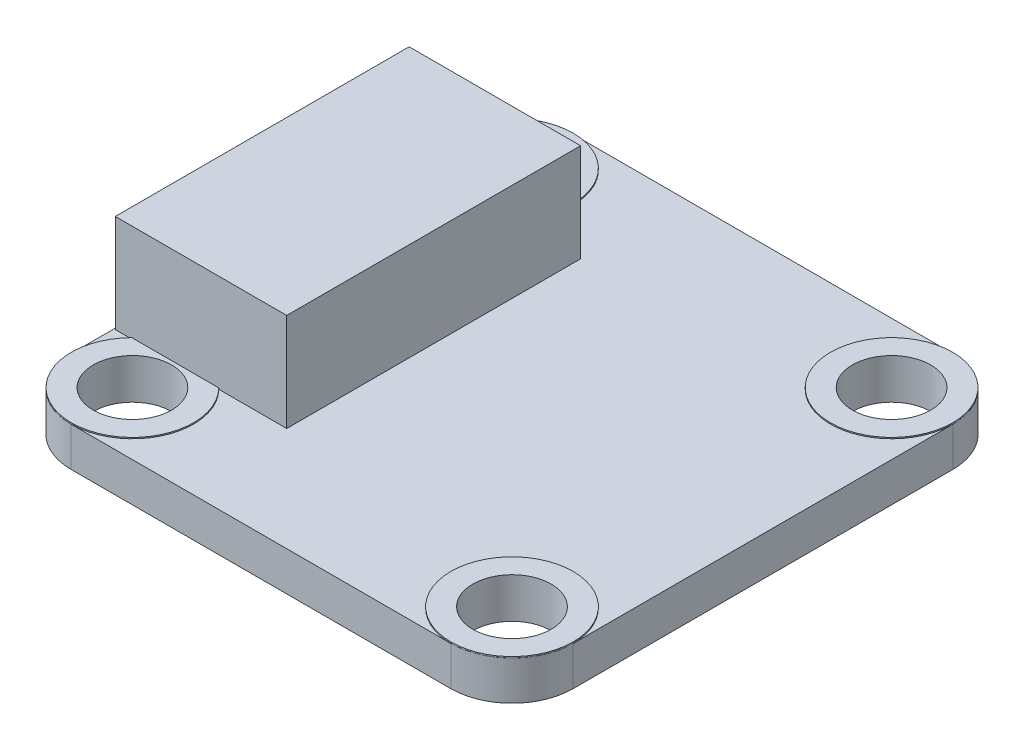
ISO-10303-21;
HEADER;
FILE_DESCRIPTION(('STEP AP214'),'2;1');
FILE_NAME('part.step','',(''),(''),'','','');
FILE_SCHEMA(('AUTOMOTIVE_DESIGN { 1 0 10303 214 1 1 1 1 }'));
ENDSEC;
DATA;
#1=APPLICATION_CONTEXT('core data for automotive mechanical design processes');
#2=APPLICATION_PROTOCOL_DEFINITION('international standard','automotive_design',2000,#1);
#3=PRODUCT_CONTEXT('',#1,'mechanical');
#4=PRODUCT('Part','Part','',(#3));
#5=PRODUCT_RELATED_PRODUCT_CATEGORY('part','',(#4));
#6=PRODUCT_DEFINITION_FORMATION('','',#4);
#7=PRODUCT_DEFINITION_CONTEXT('part definition',#1,'design');
#8=PRODUCT_DEFINITION('design','',#6,#7);
#9=PRODUCT_DEFINITION_SHAPE('','',#8);
#10=(LENGTH_UNIT() NAMED_UNIT(*) SI_UNIT(.MILLI.,.METRE.));
#11=(NAMED_UNIT(*) PLANE_ANGLE_UNIT() SI_UNIT($,.RADIAN.));
#12=(NAMED_UNIT(*) SI_UNIT($,.STERADIAN.) SOLID_ANGLE_UNIT());
#13=UNCERTAINTY_MEASURE_WITH_UNIT(LENGTH_MEASURE(1.E-05),#10,'distance_accuracy_value','');
#14=(GEOMETRIC_REPRESENTATION_CONTEXT(3) GLOBAL_UNCERTAINTY_ASSIGNED_CONTEXT((#13)) GLOBAL_UNIT_ASSIGNED_CONTEXT((#10,
#11,#12)) REPRESENTATION_CONTEXT('',''));
#15=CARTESIAN_POINT('',(0.,0.,0.));
#16=DIRECTION('',(0.,0.,1.));
#17=DIRECTION('',(1.,0.,0.));
#18=AXIS2_PLACEMENT_3D('',#15,#16,#17);
#19=CARTESIAN_POINT('',(-7.75,1.6,7.75));
#20=DIRECTION('',(0.,-1.,0.));
#21=DIRECTION('',(0.,0.,-1.));
#22=AXIS2_PLACEMENT_3D('',#19,#20,#21);
#23=PLANE('',#22);
#24=CARTESIAN_POINT('',(-7.75,1.6,7.75));
#25=DIRECTION('',(0.,1.,0.));
#26=DIRECTION('',(0.,0.,-1.));
#27=AXIS2_PLACEMENT_3D('',#24,#25,#26);
#28=CIRCLE('',#27,2.5);
#29=CARTESIAN_POINT('',(-10.25,1.6,7.75));
#30=VERTEX_POINT('',#29);
#31=CARTESIAN_POINT('',(-7.75,1.6,10.25));
#32=VERTEX_POINT('',#31);
#33=EDGE_CURVE('E160',#30,#32,#28,.T.);
#34=ORIENTED_EDGE('',*,*,#33,.T.);
#35=DIRECTION('',(1.,0.,0.));
#36=VECTOR('',#35,1.);
#37=CARTESIAN_POINT('',(7.75,1.6,10.25));
#38=LINE('',#37,#36);
#39=CARTESIAN_POINT('',(7.75,1.6,10.25));
#40=VERTEX_POINT('',#39);
#41=EDGE_CURVE('E101',#32,#40,#38,.T.);
#42=ORIENTED_EDGE('',*,*,#41,.T.);
#43=CARTESIAN_POINT('',(7.75,1.6,7.75));
#44=DIRECTION('',(0.,1.,0.));
#45=DIRECTION('',(0.,0.,1.));
#46=AXIS2_PLACEMENT_3D('',#43,#44,#45);
#47=CIRCLE('',#46,2.5);
#48=CARTESIAN_POINT('',(10.25,1.6,7.75));
#49=VERTEX_POINT('',#48);
#50=EDGE_CURVE('E216',#40,#49,#47,.T.);
#51=ORIENTED_EDGE('',*,*,#50,.T.);
#52=DIRECTION('',(0.,0.,-1.));
#53=VECTOR('',#52,1.);
#54=CARTESIAN_POINT('',(10.25,1.6,7.75));
#55=LINE('',#54,#53);
#56=CARTESIAN_POINT('',(10.25,1.6,-7.75));
#57=VERTEX_POINT('',#56);
#58=EDGE_CURVE('E218',#49,#57,#55,.T.);
#59=ORIENTED_EDGE('',*,*,#58,.T.);
#60=CARTESIAN_POINT('',(7.75,1.6,-7.75));
#61=DIRECTION('',(0.,1.,0.));
#62=DIRECTION('',(0.,0.,1.));
#63=AXIS2_PLACEMENT_3D('',#60,#61,#62);
#64=CIRCLE('',#63,2.5);
#65=CARTESIAN_POINT('',(7.75,1.6,-10.25));
#66=VERTEX_POINT('',#65);
#67=EDGE_CURVE('E123',#57,#66,#64,.T.);
#68=ORIENTED_EDGE('',*,*,#67,.T.);
#69=DIRECTION('',(-1.,0.,0.));
#70=VECTOR('',#69,1.);
#71=CARTESIAN_POINT('',(7.75,1.6,-10.25));
#72=LINE('',#71,#70);
#73=CARTESIAN_POINT('',(-7.74999999999998,1.6,-10.25));
#74=VERTEX_POINT('',#73);
#75=EDGE_CURVE('E116',#66,#74,#72,.T.);
#76=ORIENTED_EDGE('',*,*,#75,.T.);
#77=CARTESIAN_POINT('',(-7.75,1.6,-7.75));
#78=DIRECTION('',(0.,1.,0.));
#79=DIRECTION('',(0.,0.,1.));
#80=AXIS2_PLACEMENT_3D('',#77,#78,#79);
#81=CIRCLE('',#80,2.5);
#82=CARTESIAN_POINT('',(-10.25,1.6,-7.74999999999998));
#83=VERTEX_POINT('',#82);
#84=EDGE_CURVE('E120',#74,#83,#81,.T.);
#85=ORIENTED_EDGE('',*,*,#84,.T.);
#86=DIRECTION('',(0.,0.,1.));
#87=VECTOR('',#86,1.);
#88=CARTESIAN_POINT('',(-10.25,1.6,7.75));
#89=LINE('',#88,#87);
#90=EDGE_CURVE('E59',#83,#30,#89,.T.);
#91=ORIENTED_EDGE('',*,*,#90,.T.);
#92=EDGE_LOOP('',(#34,#42,#51,#59,#68,#76,#85,#91));
#93=FACE_BOUND('',#92,.T.);
#94=CARTESIAN_POINT('',(7.75,1.6,-7.75));
#95=DIRECTION('',(0.,-1.,0.));
#96=DIRECTION('',(0.,0.,-1.));
#97=AXIS2_PLACEMENT_3D('',#94,#95,#96);
#98=CIRCLE('',#97,2.495);
#99=CARTESIAN_POINT('',(7.75,1.6,-10.245));
#100=VERTEX_POINT('',#99);
#101=EDGE_CURVE('E178',#100,#100,#98,.F.);
#102=ORIENTED_EDGE('',*,*,#101,.F.);
#103=EDGE_LOOP('',(#102));
#104=FACE_BOUND('',#103,.T.);
#105=CARTESIAN_POINT('',(7.75,1.6,7.75));
#106=DIRECTION('',(0.,-1.,0.));
#107=DIRECTION('',(0.,0.,-1.));
#108=AXIS2_PLACEMENT_3D('',#105,#106,#107);
#109=CIRCLE('',#108,2.495);
#110=CARTESIAN_POINT('',(7.75,1.6,5.255));
#111=VERTEX_POINT('',#110);
#112=EDGE_CURVE('E181',#111,#111,#109,.F.);
#113=ORIENTED_EDGE('',*,*,#112,.F.);
#114=EDGE_LOOP('',(#113));
#115=FACE_BOUND('',#114,.T.);
#116=DIRECTION('',(1.,0.,0.));
#117=VECTOR('',#116,1.);
#118=CARTESIAN_POINT('',(-3.2,1.6,6.));
#119=LINE('',#118,#117);
#120=CARTESIAN_POINT('',(-5.97165104661655,1.6,6.));
#121=VERTEX_POINT('',#120);
#122=CARTESIAN_POINT('',(-3.2,1.6,6.));
#123=VERTEX_POINT('',#122);
#124=EDGE_CURVE('E536',#121,#123,#119,.T.);
#125=ORIENTED_EDGE('',*,*,#124,.F.);
#126=CARTESIAN_POINT('',(-7.75,1.6,7.75));
#127=DIRECTION('',(0.,-1.,0.));
#128=DIRECTION('',(0.,0.,-1.));
#129=AXIS2_PLACEMENT_3D('',#126,#127,#128);
#130=CIRCLE('',#129,2.495);
#131=CARTESIAN_POINT('',(-9.52834895338344,1.6,6.));
#132=VERTEX_POINT('',#131);
#133=EDGE_CURVE('E184',#132,#121,#130,.F.);
#134=ORIENTED_EDGE('',*,*,#133,.F.);
#135=CARTESIAN_POINT('',(-10.2,1.6,6.));
#136=VERTEX_POINT('',#135);
#137=EDGE_CURVE('E537',#136,#132,#119,.T.);
#138=ORIENTED_EDGE('',*,*,#137,.F.);
#139=DIRECTION('',(0.,0.,1.));
#140=VECTOR('',#139,1.);
#141=CARTESIAN_POINT('',(-10.2,1.6,6.));
#142=LINE('',#141,#140);
#143=CARTESIAN_POINT('',(-10.2,1.6,-6.));
#144=VERTEX_POINT('',#143);
#145=EDGE_CURVE('E460',#144,#136,#142,.T.);
#146=ORIENTED_EDGE('',*,*,#145,.F.);
#147=DIRECTION('',(-1.,0.,0.));
#148=VECTOR('',#147,1.);
#149=CARTESIAN_POINT('',(-3.2,1.6,-6.));
#150=LINE('',#149,#148);
#151=CARTESIAN_POINT('',(-9.52834895338345,1.6,-6.));
#152=VERTEX_POINT('',#151);
#153=EDGE_CURVE('E523',#152,#144,#150,.T.);
#154=ORIENTED_EDGE('',*,*,#153,.F.);
#155=CARTESIAN_POINT('',(-7.75,1.6,-7.75));
#156=DIRECTION('',(0.,-1.,0.));
#157=DIRECTION('',(0.,0.,-1.));
#158=AXIS2_PLACEMENT_3D('',#155,#156,#157);
#159=CIRCLE('',#158,2.495);
#160=CARTESIAN_POINT('',(-5.97165104661655,1.6,-6.));
#161=VERTEX_POINT('',#160);
#162=EDGE_CURVE('E175',#161,#152,#159,.F.);
#163=ORIENTED_EDGE('',*,*,#162,.F.);
#164=CARTESIAN_POINT('',(-3.2,1.6,-6.));
#165=VERTEX_POINT('',#164);
#166=EDGE_CURVE('E453',#165,#161,#150,.T.);
#167=ORIENTED_EDGE('',*,*,#166,.F.);
#168=DIRECTION('',(0.,0.,-1.));
#169=VECTOR('',#168,1.);
#170=CARTESIAN_POINT('',(-3.2,1.6,6.));
#171=LINE('',#170,#169);
#172=EDGE_CURVE('E526',#123,#165,#171,.T.);
#173=ORIENTED_EDGE('',*,*,#172,.F.);
#174=EDGE_LOOP('',(#125,#134,#138,#146,#154,#163,#167,#173));
#175=FACE_BOUND('',#174,.T.);
#176=ADVANCED_FACE('F35',(#93,#104,#115,#175),#23,.F.);
#177=CARTESIAN_POINT('',(-7.75,1.65,-7.75));
#178=DIRECTION('',(0.,-1.,0.));
#179=DIRECTION('',(0.,0.,-1.));
#180=AXIS2_PLACEMENT_3D('',#177,#178,#179);
#181=CYLINDRICAL_SURFACE('',#180,2.495);
#182=DIRECTION('',(0.,-1.,0.));
#183=VECTOR('',#182,1.);
#184=CARTESIAN_POINT('',(-9.52834895338345,1.65,-6.));
#185=LINE('',#184,#183);
#186=CARTESIAN_POINT('',(-9.52834895338345,1.65,-6.));
#187=VERTEX_POINT('',#186);
#188=EDGE_CURVE('E474',#187,#152,#185,.T.);
#189=ORIENTED_EDGE('',*,*,#188,.F.);
#190=CARTESIAN_POINT('',(-7.75,1.65,-7.75));
#191=DIRECTION('',(0.,1.,0.));
#192=DIRECTION('',(0.,0.,1.));
#193=AXIS2_PLACEMENT_3D('',#190,#191,#192);
#194=CIRCLE('',#193,2.495);
#195=CARTESIAN_POINT('',(-5.97165104661655,1.65,-6.));
#196=VERTEX_POINT('',#195);
#197=EDGE_CURVE('E148',#196,#187,#194,.T.);
#198=ORIENTED_EDGE('',*,*,#197,.F.);
#199=DIRECTION('',(0.,-1.,0.));
#200=VECTOR('',#199,1.);
#201=CARTESIAN_POINT('',(-5.97165104661655,1.65,-6.));
#202=LINE('',#201,#200);
#203=EDGE_CURVE('E471',#161,#196,#202,.F.);
#204=ORIENTED_EDGE('',*,*,#203,.F.);
#205=ORIENTED_EDGE('',*,*,#162,.T.);
#206=EDGE_LOOP('',(#189,#198,#204,#205));
#207=FACE_BOUND('',#206,.T.);
#208=ADVANCED_FACE('F248',(#207),#181,.T.);
#209=CARTESIAN_POINT('',(-7.75,1.65,-7.75));
#210=DIRECTION('',(0.,1.,0.));
#211=DIRECTION('',(0.,0.,1.));
#212=AXIS2_PLACEMENT_3D('',#209,#210,#211);
#213=PLANE('',#212);
#214=CARTESIAN_POINT('',(-7.75,1.65,-7.75));
#215=DIRECTION('',(0.,1.,0.));
#216=DIRECTION('',(0.,0.,1.));
#217=AXIS2_PLACEMENT_3D('',#214,#215,#216);
#218=CIRCLE('',#217,1.6);
#219=CARTESIAN_POINT('',(-7.75,1.65,-6.15));
#220=VERTEX_POINT('',#219);
#221=EDGE_CURVE('E206',#220,#220,#218,.T.);
#222=ORIENTED_EDGE('',*,*,#221,.F.);
#223=EDGE_LOOP('',(#222));
#224=FACE_BOUND('',#223,.T.);
#225=ORIENTED_EDGE('',*,*,#197,.T.);
#226=DIRECTION('',(1.,0.,0.));
#227=VECTOR('',#226,1.);
#228=CARTESIAN_POINT('',(-7.75,1.65,-6.));
#229=LINE('',#228,#227);
#230=EDGE_CURVE('E11',#187,#196,#229,.T.);
#231=ORIENTED_EDGE('',*,*,#230,.T.);
#232=EDGE_LOOP('',(#225,#231));
#233=FACE_BOUND('',#232,.T.);
#234=ADVANCED_FACE('F254',(#224,#233),#213,.T.);
#235=CARTESIAN_POINT('',(-7.75,1.65,7.75));
#236=DIRECTION('',(0.,-1.,0.));
#237=DIRECTION('',(0.,0.,-1.));
#238=AXIS2_PLACEMENT_3D('',#235,#236,#237);
#239=CYLINDRICAL_SURFACE('',#238,2.495);
#240=DIRECTION('',(0.,-1.,0.));
#241=VECTOR('',#240,1.);
#242=CARTESIAN_POINT('',(-5.97165104661655,1.65,6.));
#243=LINE('',#242,#241);
#244=CARTESIAN_POINT('',(-5.97165104661655,1.65,6.));
#245=VERTEX_POINT('',#244);
#246=EDGE_CURVE('E198',#245,#121,#243,.T.);
#247=ORIENTED_EDGE('',*,*,#246,.F.);
#248=CARTESIAN_POINT('',(-7.75,1.65,7.75));
#249=DIRECTION('',(0.,1.,0.));
#250=DIRECTION('',(0.,0.,1.));
#251=AXIS2_PLACEMENT_3D('',#248,#249,#250);
#252=CIRCLE('',#251,2.495);
#253=CARTESIAN_POINT('',(-9.52834895338344,1.65,6.));
#254=VERTEX_POINT('',#253);
#255=EDGE_CURVE('E191',#254,#245,#252,.T.);
#256=ORIENTED_EDGE('',*,*,#255,.F.);
#257=DIRECTION('',(0.,-1.,0.));
#258=VECTOR('',#257,1.);
#259=CARTESIAN_POINT('',(-9.52834895338344,1.65,6.));
#260=LINE('',#259,#258);
#261=EDGE_CURVE('E50',#132,#254,#260,.F.);
#262=ORIENTED_EDGE('',*,*,#261,.F.);
#263=ORIENTED_EDGE('',*,*,#133,.T.);
#264=EDGE_LOOP('',(#247,#256,#262,#263));
#265=FACE_BOUND('',#264,.T.);
#266=ADVANCED_FACE('F195',(#265),#239,.T.);
#267=CARTESIAN_POINT('',(-7.75,1.65,7.75));
#268=DIRECTION('',(0.,1.,0.));
#269=DIRECTION('',(0.,0.,1.));
#270=AXIS2_PLACEMENT_3D('',#267,#268,#269);
#271=PLANE('',#270);
#272=CARTESIAN_POINT('',(-7.75,1.65,7.75));
#273=DIRECTION('',(0.,1.,0.));
#274=DIRECTION('',(0.,0.,1.));
#275=AXIS2_PLACEMENT_3D('',#272,#273,#274);
#276=CIRCLE('',#275,1.60000000000042);
#277=CARTESIAN_POINT('',(-7.75,1.65,9.35000000000042));
#278=VERTEX_POINT('',#277);
#279=EDGE_CURVE('E477',#278,#278,#276,.T.);
#280=ORIENTED_EDGE('',*,*,#279,.F.);
#281=EDGE_LOOP('',(#280));
#282=FACE_BOUND('',#281,.T.);
#283=ORIENTED_EDGE('',*,*,#255,.T.);
#284=DIRECTION('',(-1.,0.,0.));
#285=VECTOR('',#284,1.);
#286=CARTESIAN_POINT('',(-7.75,1.65,6.));
#287=LINE('',#286,#285);
#288=EDGE_CURVE('E43',#245,#254,#287,.T.);
#289=ORIENTED_EDGE('',*,*,#288,.T.);
#290=EDGE_LOOP('',(#283,#289));
#291=FACE_BOUND('',#290,.T.);
#292=ADVANCED_FACE('F189',(#282,#291),#271,.T.);
#293=CARTESIAN_POINT('',(-7.75,1.6,7.75));
#294=DIRECTION('',(0.,-1.,0.));
#295=DIRECTION('',(0.,0.,-1.));
#296=AXIS2_PLACEMENT_3D('',#293,#294,#295);
#297=CYLINDRICAL_SURFACE('',#296,2.5);
#298=CARTESIAN_POINT('',(-7.75,0.,7.75));
#299=DIRECTION('',(0.,1.,0.));
#300=DIRECTION('',(0.,0.,-1.));
#301=AXIS2_PLACEMENT_3D('',#298,#299,#300);
#302=CIRCLE('',#301,2.5);
#303=CARTESIAN_POINT('',(-10.25,0.,7.75));
#304=VERTEX_POINT('',#303);
#305=CARTESIAN_POINT('',(-7.75,0.,10.25));
#306=VERTEX_POINT('',#305);
#307=EDGE_CURVE('E144',#304,#306,#302,.T.);
#308=ORIENTED_EDGE('',*,*,#307,.T.);
#309=DIRECTION('',(0.,-1.,0.));
#310=VECTOR('',#309,1.);
#311=CARTESIAN_POINT('',(-7.75,1.6,10.25));
#312=LINE('',#311,#310);
#313=EDGE_CURVE('E173',#32,#306,#312,.T.);
#314=ORIENTED_EDGE('',*,*,#313,.F.);
#315=ORIENTED_EDGE('',*,*,#33,.F.);
#316=DIRECTION('',(0.,-1.,0.));
#317=VECTOR('',#316,1.);
#318=CARTESIAN_POINT('',(-10.25,1.6,7.75));
#319=LINE('',#318,#317);
#320=EDGE_CURVE('E140',#30,#304,#319,.T.);
#321=ORIENTED_EDGE('',*,*,#320,.T.);
#322=EDGE_LOOP('',(#308,#314,#315,#321));
#323=FACE_BOUND('',#322,.T.);
#324=ADVANCED_FACE('F37',(#323),#297,.T.);
#325=CARTESIAN_POINT('',(7.75,1.6,10.25));
#326=DIRECTION('',(0.,0.,-1.));
#327=DIRECTION('',(-1.,0.,0.));
#328=AXIS2_PLACEMENT_3D('',#325,#326,#327);
#329=PLANE('',#328);
#330=DIRECTION('',(1.,0.,0.));
#331=VECTOR('',#330,1.);
#332=CARTESIAN_POINT('',(7.75,0.,10.25));
#333=LINE('',#332,#331);
#334=CARTESIAN_POINT('',(7.75,0.,10.25));
#335=VERTEX_POINT('',#334);
#336=EDGE_CURVE('E147',#306,#335,#333,.T.);
#337=ORIENTED_EDGE('',*,*,#336,.T.);
#338=DIRECTION('',(0.,-1.,0.));
#339=VECTOR('',#338,1.);
#340=CARTESIAN_POINT('',(7.75,1.6,10.25));
#341=LINE('',#340,#339);
#342=EDGE_CURVE('E170',#40,#335,#341,.T.);
#343=ORIENTED_EDGE('',*,*,#342,.F.);
#344=ORIENTED_EDGE('',*,*,#41,.F.);
#345=ORIENTED_EDGE('',*,*,#313,.T.);
#346=EDGE_LOOP('',(#337,#343,#344,#345));
#347=FACE_BOUND('',#346,.T.);
#348=ADVANCED_FACE('F236',(#347),#329,.F.);
#349=CARTESIAN_POINT('',(7.75,1.6,7.75));
#350=DIRECTION('',(0.,-1.,0.));
#351=DIRECTION('',(0.,0.,-1.));
#352=AXIS2_PLACEMENT_3D('',#349,#350,#351);
#353=CYLINDRICAL_SURFACE('',#352,2.5);
#354=CARTESIAN_POINT('',(7.75,0.,7.75));
#355=DIRECTION('',(0.,1.,0.));
#356=DIRECTION('',(0.,0.,1.));
#357=AXIS2_PLACEMENT_3D('',#354,#355,#356);
#358=CIRCLE('',#357,2.5);
#359=CARTESIAN_POINT('',(10.25,0.,7.75));
#360=VERTEX_POINT('',#359);
#361=EDGE_CURVE('E150',#335,#360,#358,.T.);
#362=ORIENTED_EDGE('',*,*,#361,.T.);
#363=DIRECTION('',(0.,-1.,0.));
#364=VECTOR('',#363,1.);
#365=CARTESIAN_POINT('',(10.25,1.6,7.75));
#366=LINE('',#365,#364);
#367=EDGE_CURVE('E167',#49,#360,#366,.T.);
#368=ORIENTED_EDGE('',*,*,#367,.F.);
#369=ORIENTED_EDGE('',*,*,#50,.F.);
#370=ORIENTED_EDGE('',*,*,#342,.T.);
#371=EDGE_LOOP('',(#362,#368,#369,#370));
#372=FACE_BOUND('',#371,.T.);
#373=ADVANCED_FACE('F239',(#372),#353,.T.);
#374=CARTESIAN_POINT('',(10.25,1.6,7.75));
#375=DIRECTION('',(-1.,0.,0.));
#376=DIRECTION('',(0.,0.,1.));
#377=AXIS2_PLACEMENT_3D('',#374,#375,#376);
#378=PLANE('',#377);
#379=DIRECTION('',(0.,0.,-1.));
#380=VECTOR('',#379,1.);
#381=CARTESIAN_POINT('',(10.25,0.,7.75));
#382=LINE('',#381,#380);
#383=CARTESIAN_POINT('',(10.25,0.,-7.75));
#384=VERTEX_POINT('',#383);
#385=EDGE_CURVE('E152',#360,#384,#382,.T.);
#386=ORIENTED_EDGE('',*,*,#385,.T.);
#387=DIRECTION('',(0.,-1.,0.));
#388=VECTOR('',#387,1.);
#389=CARTESIAN_POINT('',(10.25,1.6,-7.75));
#390=LINE('',#389,#388);
#391=EDGE_CURVE('E164',#57,#384,#390,.T.);
#392=ORIENTED_EDGE('',*,*,#391,.F.);
#393=ORIENTED_EDGE('',*,*,#58,.F.);
#394=ORIENTED_EDGE('',*,*,#367,.T.);
#395=EDGE_LOOP('',(#386,#392,#393,#394));
#396=FACE_BOUND('',#395,.T.);
#397=ADVANCED_FACE('F224',(#396),#378,.F.);
#398=CARTESIAN_POINT('',(7.75,1.6,-7.75));
#399=DIRECTION('',(0.,-1.,0.));
#400=DIRECTION('',(0.,0.,-1.));
#401=AXIS2_PLACEMENT_3D('',#398,#399,#400);
#402=CYLINDRICAL_SURFACE('',#401,2.5);
#403=CARTESIAN_POINT('',(7.75,0.,-7.75));
#404=DIRECTION('',(0.,1.,0.));
#405=DIRECTION('',(0.,0.,1.));
#406=AXIS2_PLACEMENT_3D('',#403,#404,#405);
#407=CIRCLE('',#406,2.5);
#408=CARTESIAN_POINT('',(7.75,0.,-10.25));
#409=VERTEX_POINT('',#408);
#410=EDGE_CURVE('E154',#384,#409,#407,.T.);
#411=ORIENTED_EDGE('',*,*,#410,.T.);
#412=DIRECTION('',(0.,-1.,0.));
#413=VECTOR('',#412,1.);
#414=CARTESIAN_POINT('',(7.75,1.6,-10.25));
#415=LINE('',#414,#413);
#416=EDGE_CURVE('E135',#66,#409,#415,.T.);
#417=ORIENTED_EDGE('',*,*,#416,.F.);
#418=ORIENTED_EDGE('',*,*,#67,.F.);
#419=ORIENTED_EDGE('',*,*,#391,.T.);
#420=EDGE_LOOP('',(#411,#417,#418,#419));
#421=FACE_BOUND('',#420,.T.);
#422=ADVANCED_FACE('F228',(#421),#402,.T.);
#423=CARTESIAN_POINT('',(7.75,1.6,-10.25));
#424=DIRECTION('',(0.,0.,1.));
#425=DIRECTION('',(1.,0.,0.));
#426=AXIS2_PLACEMENT_3D('',#423,#424,#425);
#427=PLANE('',#426);
#428=DIRECTION('',(-1.,0.,0.));
#429=VECTOR('',#428,1.);
#430=CARTESIAN_POINT('',(7.75,0.,-10.25));
#431=LINE('',#430,#429);
#432=CARTESIAN_POINT('',(-7.74999999999998,0.,-10.25));
#433=VERTEX_POINT('',#432);
#434=EDGE_CURVE('E132',#409,#433,#431,.T.);
#435=ORIENTED_EDGE('',*,*,#434,.T.);
#436=DIRECTION('',(0.,-1.,0.));
#437=VECTOR('',#436,1.);
#438=CARTESIAN_POINT('',(-7.74999999999998,1.6,-10.25));
#439=LINE('',#438,#437);
#440=EDGE_CURVE('E129',#74,#433,#439,.T.);
#441=ORIENTED_EDGE('',*,*,#440,.F.);
#442=ORIENTED_EDGE('',*,*,#75,.F.);
#443=ORIENTED_EDGE('',*,*,#416,.T.);
#444=EDGE_LOOP('',(#435,#441,#442,#443));
#445=FACE_BOUND('',#444,.T.);
#446=ADVANCED_FACE('F130',(#445),#427,.F.);
#447=CARTESIAN_POINT('',(-7.75,1.6,-7.75));
#448=DIRECTION('',(0.,-1.,0.));
#449=DIRECTION('',(0.,0.,-1.));
#450=AXIS2_PLACEMENT_3D('',#447,#448,#449);
#451=CYLINDRICAL_SURFACE('',#450,2.5);
#452=CARTESIAN_POINT('',(-7.75,0.,-7.75));
#453=DIRECTION('',(0.,1.,0.));
#454=DIRECTION('',(0.,0.,1.));
#455=AXIS2_PLACEMENT_3D('',#452,#453,#454);
#456=CIRCLE('',#455,2.5);
#457=CARTESIAN_POINT('',(-10.25,0.,-7.74999999999998));
#458=VERTEX_POINT('',#457);
#459=EDGE_CURVE('E157',#433,#458,#456,.T.);
#460=ORIENTED_EDGE('',*,*,#459,.T.);
#461=DIRECTION('',(0.,-1.,0.));
#462=VECTOR('',#461,1.);
#463=CARTESIAN_POINT('',(-10.25,1.6,-7.74999999999998));
#464=LINE('',#463,#462);
#465=EDGE_CURVE('E136',#83,#458,#464,.T.);
#466=ORIENTED_EDGE('',*,*,#465,.F.);
#467=ORIENTED_EDGE('',*,*,#84,.F.);
#468=ORIENTED_EDGE('',*,*,#440,.T.);
#469=EDGE_LOOP('',(#460,#466,#467,#468));
#470=FACE_BOUND('',#469,.T.);
#471=ADVANCED_FACE('F138',(#470),#451,.T.);
#472=CARTESIAN_POINT('',(-10.25,1.6,7.75));
#473=DIRECTION('',(1.,0.,0.));
#474=DIRECTION('',(0.,0.,-1.));
#475=AXIS2_PLACEMENT_3D('',#472,#473,#474);
#476=PLANE('',#475);
#477=DIRECTION('',(0.,0.,1.));
#478=VECTOR('',#477,1.);
#479=CARTESIAN_POINT('',(-10.25,0.,7.75));
#480=LINE('',#479,#478);
#481=EDGE_CURVE('E92',#458,#304,#480,.T.);
#482=ORIENTED_EDGE('',*,*,#481,.T.);
#483=ORIENTED_EDGE('',*,*,#320,.F.);
#484=ORIENTED_EDGE('',*,*,#90,.F.);
#485=ORIENTED_EDGE('',*,*,#465,.T.);
#486=EDGE_LOOP('',(#482,#483,#484,#485));
#487=FACE_BOUND('',#486,.T.);
#488=ADVANCED_FACE('F232',(#487),#476,.F.);
#489=CARTESIAN_POINT('',(-7.75,0.,7.75));
#490=DIRECTION('',(0.,-1.,0.));
#491=DIRECTION('',(0.,0.,-1.));
#492=AXIS2_PLACEMENT_3D('',#489,#490,#491);
#493=PLANE('',#492);
#494=CARTESIAN_POINT('',(-7.75,0.,7.75));
#495=DIRECTION('',(0.,1.,0.));
#496=DIRECTION('',(0.,0.,1.));
#497=AXIS2_PLACEMENT_3D('',#494,#495,#496);
#498=CIRCLE('',#497,1.60000000000042);
#499=CARTESIAN_POINT('',(-7.75,0.,9.35000000000042));
#500=VERTEX_POINT('',#499);
#501=EDGE_CURVE('E490',#500,#500,#498,.T.);
#502=ORIENTED_EDGE('',*,*,#501,.T.);
#503=EDGE_LOOP('',(#502));
#504=FACE_BOUND('',#503,.T.);
#505=CARTESIAN_POINT('',(7.75,0.,7.75));
#506=DIRECTION('',(0.,1.,0.));
#507=DIRECTION('',(0.,0.,1.));
#508=AXIS2_PLACEMENT_3D('',#505,#506,#507);
#509=CIRCLE('',#508,1.60000000000055);
#510=CARTESIAN_POINT('',(7.75,0.,9.35000000000054));
#511=VERTEX_POINT('',#510);
#512=EDGE_CURVE('E484',#511,#511,#509,.T.);
#513=ORIENTED_EDGE('',*,*,#512,.T.);
#514=EDGE_LOOP('',(#513));
#515=FACE_BOUND('',#514,.T.);
#516=CARTESIAN_POINT('',(7.75,0.,-7.75));
#517=DIRECTION('',(0.,1.,0.));
#518=DIRECTION('',(0.,0.,1.));
#519=AXIS2_PLACEMENT_3D('',#516,#517,#518);
#520=CIRCLE('',#519,1.60000000000013);
#521=CARTESIAN_POINT('',(7.75,0.,-6.14999999999987));
#522=VERTEX_POINT('',#521);
#523=EDGE_CURVE('E478',#522,#522,#520,.T.);
#524=ORIENTED_EDGE('',*,*,#523,.T.);
#525=EDGE_LOOP('',(#524));
#526=FACE_BOUND('',#525,.T.);
#527=CARTESIAN_POINT('',(-7.75,0.,-7.75));
#528=DIRECTION('',(0.,1.,0.));
#529=DIRECTION('',(0.,0.,1.));
#530=AXIS2_PLACEMENT_3D('',#527,#528,#529);
#531=CIRCLE('',#530,1.6);
#532=CARTESIAN_POINT('',(-7.75,0.,-6.15));
#533=VERTEX_POINT('',#532);
#534=EDGE_CURVE('E200',#533,#533,#531,.T.);
#535=ORIENTED_EDGE('',*,*,#534,.T.);
#536=EDGE_LOOP('',(#535));
#537=FACE_BOUND('',#536,.T.);
#538=ORIENTED_EDGE('',*,*,#307,.F.);
#539=ORIENTED_EDGE('',*,*,#481,.F.);
#540=ORIENTED_EDGE('',*,*,#459,.F.);
#541=ORIENTED_EDGE('',*,*,#434,.F.);
#542=ORIENTED_EDGE('',*,*,#410,.F.);
#543=ORIENTED_EDGE('',*,*,#385,.F.);
#544=ORIENTED_EDGE('',*,*,#361,.F.);
#545=ORIENTED_EDGE('',*,*,#336,.F.);
#546=EDGE_LOOP('',(#538,#539,#540,#541,#542,#543,#544,#545));
#547=FACE_BOUND('',#546,.T.);
#548=ADVANCED_FACE('F231',(#504,#515,#526,#537,#547),#493,.T.);
#549=CARTESIAN_POINT('',(7.75,1.65,-7.75));
#550=DIRECTION('',(0.,-1.,0.));
#551=DIRECTION('',(0.,0.,-1.));
#552=AXIS2_PLACEMENT_3D('',#549,#550,#551);
#553=CYLINDRICAL_SURFACE('',#552,2.495);
#554=CARTESIAN_POINT('',(7.75,1.65,-7.75));
#555=DIRECTION('',(0.,1.,0.));
#556=DIRECTION('',(0.,0.,1.));
#557=AXIS2_PLACEMENT_3D('',#554,#555,#556);
#558=CIRCLE('',#557,2.495);
#559=CARTESIAN_POINT('',(7.75,1.65,-5.255));
#560=VERTEX_POINT('',#559);
#561=EDGE_CURVE('E203',#560,#560,#558,.T.);
#562=ORIENTED_EDGE('',*,*,#561,.F.);
#563=EDGE_LOOP('',(#562));
#564=FACE_BOUND('',#563,.T.);
#565=ORIENTED_EDGE('',*,*,#101,.T.);
#566=EDGE_LOOP('',(#565));
#567=FACE_BOUND('',#566,.T.);
#568=ADVANCED_FACE('F261',(#564,#567),#553,.T.);
#569=CARTESIAN_POINT('',(7.75,1.65,-7.75));
#570=DIRECTION('',(0.,1.,0.));
#571=DIRECTION('',(0.,0.,1.));
#572=AXIS2_PLACEMENT_3D('',#569,#570,#571);
#573=PLANE('',#572);
#574=CARTESIAN_POINT('',(7.75,1.65,-7.75));
#575=DIRECTION('',(0.,1.,0.));
#576=DIRECTION('',(0.,0.,1.));
#577=AXIS2_PLACEMENT_3D('',#574,#575,#576);
#578=CIRCLE('',#577,1.60000000000013);
#579=CARTESIAN_POINT('',(7.75,1.65,-6.14999999999987));
#580=VERTEX_POINT('',#579);
#581=EDGE_CURVE('E481',#580,#580,#578,.T.);
#582=ORIENTED_EDGE('',*,*,#581,.F.);
#583=EDGE_LOOP('',(#582));
#584=FACE_BOUND('',#583,.T.);
#585=ORIENTED_EDGE('',*,*,#561,.T.);
#586=EDGE_LOOP('',(#585));
#587=FACE_BOUND('',#586,.T.);
#588=ADVANCED_FACE('F298',(#584,#587),#573,.T.);
#589=CARTESIAN_POINT('',(7.75,1.65,7.75));
#590=DIRECTION('',(0.,-1.,0.));
#591=DIRECTION('',(0.,0.,-1.));
#592=AXIS2_PLACEMENT_3D('',#589,#590,#591);
#593=CYLINDRICAL_SURFACE('',#592,2.495);
#594=CARTESIAN_POINT('',(7.75,1.65,7.75));
#595=DIRECTION('',(0.,1.,0.));
#596=DIRECTION('',(0.,0.,1.));
#597=AXIS2_PLACEMENT_3D('',#594,#595,#596);
#598=CIRCLE('',#597,2.495);
#599=CARTESIAN_POINT('',(7.75,1.65,10.245));
#600=VERTEX_POINT('',#599);
#601=EDGE_CURVE('E199',#600,#600,#598,.T.);
#602=ORIENTED_EDGE('',*,*,#601,.F.);
#603=EDGE_LOOP('',(#602));
#604=FACE_BOUND('',#603,.T.);
#605=ORIENTED_EDGE('',*,*,#112,.T.);
#606=EDGE_LOOP('',(#605));
#607=FACE_BOUND('',#606,.T.);
#608=ADVANCED_FACE('F305',(#604,#607),#593,.T.);
#609=CARTESIAN_POINT('',(7.75,1.65,7.75));
#610=DIRECTION('',(0.,1.,0.));
#611=DIRECTION('',(0.,0.,1.));
#612=AXIS2_PLACEMENT_3D('',#609,#610,#611);
#613=PLANE('',#612);
#614=CARTESIAN_POINT('',(7.75,1.65,7.75));
#615=DIRECTION('',(0.,1.,0.));
#616=DIRECTION('',(0.,0.,1.));
#617=AXIS2_PLACEMENT_3D('',#614,#615,#616);
#618=CIRCLE('',#617,1.60000000000055);
#619=CARTESIAN_POINT('',(7.75,1.65,9.35000000000054));
#620=VERTEX_POINT('',#619);
#621=EDGE_CURVE('E487',#620,#620,#618,.T.);
#622=ORIENTED_EDGE('',*,*,#621,.F.);
#623=EDGE_LOOP('',(#622));
#624=FACE_BOUND('',#623,.T.);
#625=ORIENTED_EDGE('',*,*,#601,.T.);
#626=EDGE_LOOP('',(#625));
#627=FACE_BOUND('',#626,.T.);
#628=ADVANCED_FACE('F313',(#624,#627),#613,.T.);
#629=CARTESIAN_POINT('',(-7.75,0.,7.75));
#630=DIRECTION('',(0.,1.,0.));
#631=DIRECTION('',(0.,0.,1.));
#632=AXIS2_PLACEMENT_3D('',#629,#630,#631);
#633=CYLINDRICAL_SURFACE('',#632,1.60000000000042);
#634=ORIENTED_EDGE('',*,*,#501,.F.);
#635=EDGE_LOOP('',(#634));
#636=FACE_BOUND('',#635,.T.);
#637=ORIENTED_EDGE('',*,*,#279,.T.);
#638=EDGE_LOOP('',(#637));
#639=FACE_BOUND('',#638,.T.);
#640=ADVANCED_FACE('F320',(#636,#639),#633,.F.);
#641=CARTESIAN_POINT('',(7.75,0.,7.75));
#642=DIRECTION('',(0.,1.,0.));
#643=DIRECTION('',(0.,0.,1.));
#644=AXIS2_PLACEMENT_3D('',#641,#642,#643);
#645=CYLINDRICAL_SURFACE('',#644,1.60000000000055);
#646=ORIENTED_EDGE('',*,*,#512,.F.);
#647=EDGE_LOOP('',(#646));
#648=FACE_BOUND('',#647,.T.);
#649=ORIENTED_EDGE('',*,*,#621,.T.);
#650=EDGE_LOOP('',(#649));
#651=FACE_BOUND('',#650,.T.);
#652=ADVANCED_FACE('F328',(#648,#651),#645,.F.);
#653=CARTESIAN_POINT('',(7.75,0.,-7.75));
#654=DIRECTION('',(0.,1.,0.));
#655=DIRECTION('',(0.,0.,1.));
#656=AXIS2_PLACEMENT_3D('',#653,#654,#655);
#657=CYLINDRICAL_SURFACE('',#656,1.60000000000013);
#658=ORIENTED_EDGE('',*,*,#523,.F.);
#659=EDGE_LOOP('',(#658));
#660=FACE_BOUND('',#659,.T.);
#661=ORIENTED_EDGE('',*,*,#581,.T.);
#662=EDGE_LOOP('',(#661));
#663=FACE_BOUND('',#662,.T.);
#664=ADVANCED_FACE('F336',(#660,#663),#657,.F.);
#665=CARTESIAN_POINT('',(-7.75,0.,-7.75));
#666=DIRECTION('',(0.,1.,0.));
#667=DIRECTION('',(0.,0.,1.));
#668=AXIS2_PLACEMENT_3D('',#665,#666,#667);
#669=CYLINDRICAL_SURFACE('',#668,1.6);
#670=ORIENTED_EDGE('',*,*,#534,.F.);
#671=EDGE_LOOP('',(#670));
#672=FACE_BOUND('',#671,.T.);
#673=ORIENTED_EDGE('',*,*,#221,.T.);
#674=EDGE_LOOP('',(#673));
#675=FACE_BOUND('',#674,.T.);
#676=ADVANCED_FACE('F344',(#672,#675),#669,.F.);
#677=CARTESIAN_POINT('',(-3.2,5.6,-6.));
#678=DIRECTION('',(0.,0.,1.));
#679=DIRECTION('',(1.,0.,0.));
#680=AXIS2_PLACEMENT_3D('',#677,#678,#679);
#681=PLANE('',#680);
#682=ORIENTED_EDGE('',*,*,#230,.F.);
#683=ORIENTED_EDGE('',*,*,#188,.T.);
#684=ORIENTED_EDGE('',*,*,#153,.T.);
#685=DIRECTION('',(0.,-1.,0.));
#686=VECTOR('',#685,1.);
#687=CARTESIAN_POINT('',(-10.2,5.6,-6.));
#688=LINE('',#687,#686);
#689=CARTESIAN_POINT('',(-10.2,5.6,-6.));
#690=VERTEX_POINT('',#689);
#691=EDGE_CURVE('E530',#690,#144,#688,.T.);
#692=ORIENTED_EDGE('',*,*,#691,.F.);
#693=DIRECTION('',(-1.,0.,0.));
#694=VECTOR('',#693,1.);
#695=CARTESIAN_POINT('',(-3.2,5.6,-6.));
#696=LINE('',#695,#694);
#697=CARTESIAN_POINT('',(-3.2,5.6,-6.));
#698=VERTEX_POINT('',#697);
#699=EDGE_CURVE('E448',#698,#690,#696,.T.);
#700=ORIENTED_EDGE('',*,*,#699,.F.);
#701=DIRECTION('',(0.,-1.,0.));
#702=VECTOR('',#701,1.);
#703=CARTESIAN_POINT('',(-3.2,5.6,-6.));
#704=LINE('',#703,#702);
#705=EDGE_CURVE('E466',#698,#165,#704,.T.);
#706=ORIENTED_EDGE('',*,*,#705,.T.);
#707=ORIENTED_EDGE('',*,*,#166,.T.);
#708=ORIENTED_EDGE('',*,*,#203,.T.);
#709=EDGE_LOOP('',(#682,#683,#684,#692,#700,#706,#707,#708));
#710=FACE_BOUND('',#709,.T.);
#711=ADVANCED_FACE('F351',(#710),#681,.F.);
#712=CARTESIAN_POINT('',(-3.2,5.6,6.));
#713=DIRECTION('',(0.,0.,-1.));
#714=DIRECTION('',(-1.,0.,0.));
#715=AXIS2_PLACEMENT_3D('',#712,#713,#714);
#716=PLANE('',#715);
#717=ORIENTED_EDGE('',*,*,#288,.F.);
#718=ORIENTED_EDGE('',*,*,#246,.T.);
#719=ORIENTED_EDGE('',*,*,#124,.T.);
#720=DIRECTION('',(0.,-1.,0.));
#721=VECTOR('',#720,1.);
#722=CARTESIAN_POINT('',(-3.2,5.6,6.));
#723=LINE('',#722,#721);
#724=CARTESIAN_POINT('',(-3.2,5.6,6.));
#725=VERTEX_POINT('',#724);
#726=EDGE_CURVE('E462',#725,#123,#723,.T.);
#727=ORIENTED_EDGE('',*,*,#726,.F.);
#728=DIRECTION('',(1.,0.,0.));
#729=VECTOR('',#728,1.);
#730=CARTESIAN_POINT('',(-3.2,5.6,6.));
#731=LINE('',#730,#729);
#732=CARTESIAN_POINT('',(-10.2,5.6,6.));
#733=VERTEX_POINT('',#732);
#734=EDGE_CURVE('E444',#733,#725,#731,.T.);
#735=ORIENTED_EDGE('',*,*,#734,.F.);
#736=DIRECTION('',(0.,-1.,0.));
#737=VECTOR('',#736,1.);
#738=CARTESIAN_POINT('',(-10.2,5.6,6.));
#739=LINE('',#738,#737);
#740=EDGE_CURVE('E457',#733,#136,#739,.T.);
#741=ORIENTED_EDGE('',*,*,#740,.T.);
#742=ORIENTED_EDGE('',*,*,#137,.T.);
#743=ORIENTED_EDGE('',*,*,#261,.T.);
#744=EDGE_LOOP('',(#717,#718,#719,#727,#735,#741,#742,#743));
#745=FACE_BOUND('',#744,.T.);
#746=ADVANCED_FACE('F391',(#745),#716,.F.);
#747=CARTESIAN_POINT('',(-10.2,5.6,6.));
#748=DIRECTION('',(1.,0.,0.));
#749=DIRECTION('',(0.,0.,-1.));
#750=AXIS2_PLACEMENT_3D('',#747,#748,#749);
#751=PLANE('',#750);
#752=ORIENTED_EDGE('',*,*,#145,.T.);
#753=ORIENTED_EDGE('',*,*,#740,.F.);
#754=DIRECTION('',(0.,0.,1.));
#755=VECTOR('',#754,1.);
#756=CARTESIAN_POINT('',(-10.2,5.6,6.));
#757=LINE('',#756,#755);
#758=EDGE_CURVE('E439',#690,#733,#757,.T.);
#759=ORIENTED_EDGE('',*,*,#758,.F.);
#760=ORIENTED_EDGE('',*,*,#691,.T.);
#761=EDGE_LOOP('',(#752,#753,#759,#760));
#762=FACE_BOUND('',#761,.T.);
#763=ADVANCED_FACE('F398',(#762),#751,.F.);
#764=CARTESIAN_POINT('',(-3.2,5.6,6.));
#765=DIRECTION('',(-1.,0.,0.));
#766=DIRECTION('',(0.,0.,1.));
#767=AXIS2_PLACEMENT_3D('',#764,#765,#766);
#768=PLANE('',#767);
#769=ORIENTED_EDGE('',*,*,#172,.T.);
#770=ORIENTED_EDGE('',*,*,#705,.F.);
#771=DIRECTION('',(0.,0.,-1.));
#772=VECTOR('',#771,1.);
#773=CARTESIAN_POINT('',(-3.2,5.6,6.));
#774=LINE('',#773,#772);
#775=EDGE_CURVE('E531',#725,#698,#774,.T.);
#776=ORIENTED_EDGE('',*,*,#775,.F.);
#777=ORIENTED_EDGE('',*,*,#726,.T.);
#778=EDGE_LOOP('',(#769,#770,#776,#777));
#779=FACE_BOUND('',#778,.T.);
#780=ADVANCED_FACE('F405',(#779),#768,.F.);
#781=CARTESIAN_POINT('',(0.,5.6,0.));
#782=DIRECTION('',(0.,1.,0.));
#783=DIRECTION('',(0.,0.,1.));
#784=AXIS2_PLACEMENT_3D('',#781,#782,#783);
#785=PLANE('',#784);
#786=ORIENTED_EDGE('',*,*,#758,.T.);
#787=ORIENTED_EDGE('',*,*,#734,.T.);
#788=ORIENTED_EDGE('',*,*,#775,.T.);
#789=ORIENTED_EDGE('',*,*,#699,.T.);
#790=EDGE_LOOP('',(#786,#787,#788,#789));
#791=FACE_BOUND('',#790,.T.);
#792=ADVANCED_FACE('F413',(#791),#785,.T.);
#793=CLOSED_SHELL('',(#176,#208,#234,#266,#292,#324,#348,#373,#397,#422,#446,#471,#488,#548,
#568,#588,#608,#628,#640,#652,#664,#676,#711,#746,#763,#780,#792));
#794=MANIFOLD_SOLID_BREP('B2',#793);
#795=ADVANCED_BREP_SHAPE_REPRESENTATION('',(#18,#794),#14);
#796=SHAPE_DEFINITION_REPRESENTATION(#9,#795);
ENDSEC;
END-ISO-10303-21;
